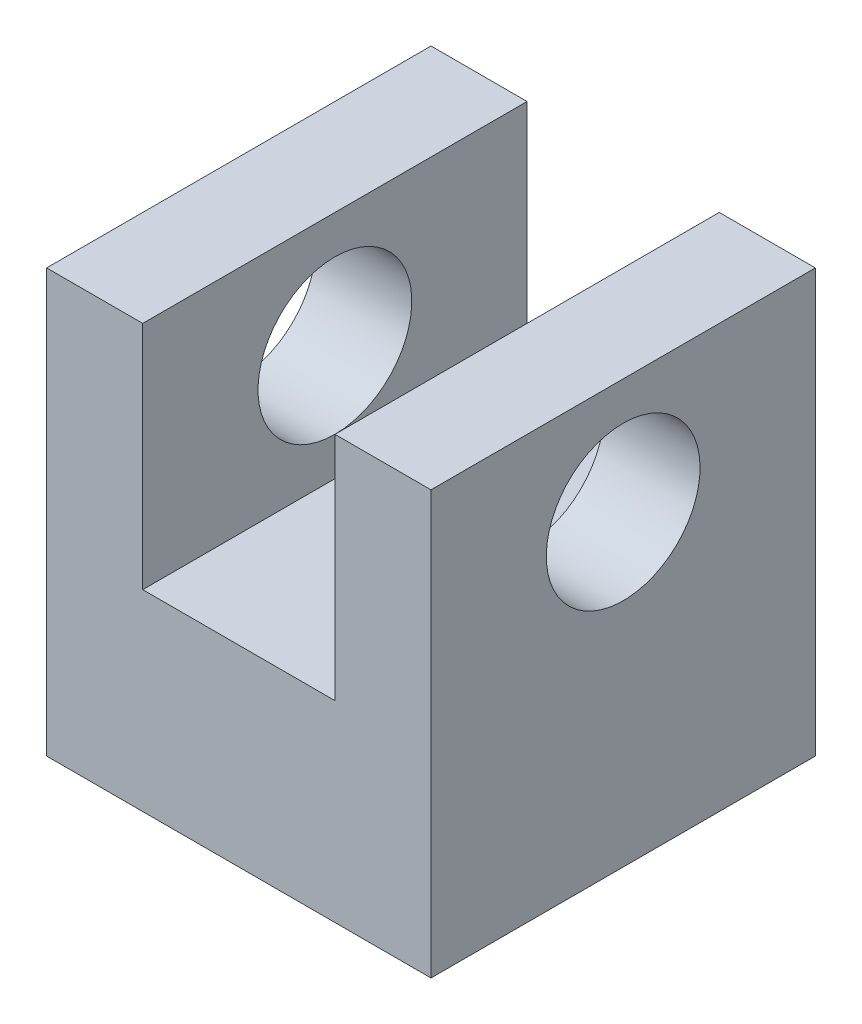
ISO-10303-21;
HEADER;
FILE_DESCRIPTION(('STEP AP214'),'2;1');
FILE_NAME('part.step','',(''),(''),'','','');
FILE_SCHEMA(('AUTOMOTIVE_DESIGN { 1 0 10303 214 1 1 1 1 }'));
ENDSEC;
DATA;
#1=APPLICATION_CONTEXT('core data for automotive mechanical design processes');
#2=APPLICATION_PROTOCOL_DEFINITION('international standard','automotive_design',2000,#1);
#3=PRODUCT_CONTEXT('',#1,'mechanical');
#4=PRODUCT('Part','Part','',(#3));
#5=PRODUCT_RELATED_PRODUCT_CATEGORY('part','',(#4));
#6=PRODUCT_DEFINITION_FORMATION('','',#4);
#7=PRODUCT_DEFINITION_CONTEXT('part definition',#1,'design');
#8=PRODUCT_DEFINITION('design','',#6,#7);
#9=PRODUCT_DEFINITION_SHAPE('','',#8);
#10=(LENGTH_UNIT() NAMED_UNIT(*) SI_UNIT(.MILLI.,.METRE.));
#11=(NAMED_UNIT(*) PLANE_ANGLE_UNIT() SI_UNIT($,.RADIAN.));
#12=(NAMED_UNIT(*) SI_UNIT($,.STERADIAN.) SOLID_ANGLE_UNIT());
#13=UNCERTAINTY_MEASURE_WITH_UNIT(LENGTH_MEASURE(1.E-05),#10,'distance_accuracy_value','');
#14=(GEOMETRIC_REPRESENTATION_CONTEXT(3) GLOBAL_UNCERTAINTY_ASSIGNED_CONTEXT((#13)) GLOBAL_UNIT_ASSIGNED_CONTEXT((#10,
#11,#12)) REPRESENTATION_CONTEXT('',''));
#15=CARTESIAN_POINT('',(0.,0.,0.));
#16=DIRECTION('',(0.,0.,1.));
#17=DIRECTION('',(1.,0.,0.));
#18=AXIS2_PLACEMENT_3D('',#15,#16,#17);
#19=CARTESIAN_POINT('',(10.,0.,20.));
#20=DIRECTION('',(-1.,0.,0.));
#21=DIRECTION('',(0.,0.,1.));
#22=AXIS2_PLACEMENT_3D('',#19,#20,#21);
#23=PLANE('',#22);
#24=CARTESIAN_POINT('',(10.,16.,10.));
#25=DIRECTION('',(1.,0.,0.));
#26=DIRECTION('',(0.,1.,0.));
#27=AXIS2_PLACEMENT_3D('',#24,#25,#26);
#28=CIRCLE('',#27,4.);
#29=CARTESIAN_POINT('',(10.,20.,10.));
#30=VERTEX_POINT('',#29);
#31=EDGE_CURVE('E218',#30,#30,#28,.T.);
#32=ORIENTED_EDGE('',*,*,#31,.F.);
#33=EDGE_LOOP('',(#32));
#34=FACE_BOUND('',#33,.T.);
#35=DIRECTION('',(0.,1.,0.));
#36=VECTOR('',#35,1.);
#37=CARTESIAN_POINT('',(10.,0.,0.));
#38=LINE('',#37,#36);
#39=CARTESIAN_POINT('',(10.,0.,0.));
#40=VERTEX_POINT('',#39);
#41=CARTESIAN_POINT('',(10.,22.,0.));
#42=VERTEX_POINT('',#41);
#43=EDGE_CURVE('E140',#40,#42,#38,.T.);
#44=ORIENTED_EDGE('',*,*,#43,.T.);
#45=DIRECTION('',(0.,0.,-1.));
#46=VECTOR('',#45,1.);
#47=CARTESIAN_POINT('',(10.,22.,20.));
#48=LINE('',#47,#46);
#49=CARTESIAN_POINT('',(10.,22.,20.));
#50=VERTEX_POINT('',#49);
#51=EDGE_CURVE('E11',#50,#42,#48,.T.);
#52=ORIENTED_EDGE('',*,*,#51,.F.);
#53=DIRECTION('',(0.,1.,0.));
#54=VECTOR('',#53,1.);
#55=CARTESIAN_POINT('',(10.,0.,20.));
#56=LINE('',#55,#54);
#57=CARTESIAN_POINT('',(10.,0.,20.));
#58=VERTEX_POINT('',#57);
#59=EDGE_CURVE('E163',#58,#50,#56,.T.);
#60=ORIENTED_EDGE('',*,*,#59,.F.);
#61=DIRECTION('',(0.,0.,-1.));
#62=VECTOR('',#61,1.);
#63=CARTESIAN_POINT('',(10.,0.,20.));
#64=LINE('',#63,#62);
#65=EDGE_CURVE('E136',#58,#40,#64,.T.);
#66=ORIENTED_EDGE('',*,*,#65,.T.);
#67=EDGE_LOOP('',(#44,#52,#60,#66));
#68=FACE_BOUND('',#67,.T.);
#69=ADVANCED_FACE('F39',(#34,#68),#23,.F.);
#70=CARTESIAN_POINT('',(10.,22.,20.));
#71=DIRECTION('',(0.,-1.,0.));
#72=DIRECTION('',(0.,0.,-1.));
#73=AXIS2_PLACEMENT_3D('',#70,#71,#72);
#74=PLANE('',#73);
#75=DIRECTION('',(-1.,0.,0.));
#76=VECTOR('',#75,1.);
#77=CARTESIAN_POINT('',(10.,22.,0.));
#78=LINE('',#77,#76);
#79=CARTESIAN_POINT('',(5.,22.,0.));
#80=VERTEX_POINT('',#79);
#81=EDGE_CURVE('E144',#42,#80,#78,.T.);
#82=ORIENTED_EDGE('',*,*,#81,.T.);
#83=DIRECTION('',(0.,0.,-1.));
#84=VECTOR('',#83,1.);
#85=CARTESIAN_POINT('',(5.,22.,20.));
#86=LINE('',#85,#84);
#87=CARTESIAN_POINT('',(5.,22.,20.));
#88=VERTEX_POINT('',#87);
#89=EDGE_CURVE('E48',#88,#80,#86,.T.);
#90=ORIENTED_EDGE('',*,*,#89,.F.);
#91=DIRECTION('',(-1.,0.,0.));
#92=VECTOR('',#91,1.);
#93=CARTESIAN_POINT('',(10.,22.,20.));
#94=LINE('',#93,#92);
#95=EDGE_CURVE('E99',#50,#88,#94,.T.);
#96=ORIENTED_EDGE('',*,*,#95,.F.);
#97=ORIENTED_EDGE('',*,*,#51,.T.);
#98=EDGE_LOOP('',(#82,#90,#96,#97));
#99=FACE_BOUND('',#98,.T.);
#100=ADVANCED_FACE('F228',(#99),#74,.F.);
#101=CARTESIAN_POINT('',(5.,22.,20.));
#102=DIRECTION('',(1.,0.,0.));
#103=DIRECTION('',(0.,1.,0.));
#104=AXIS2_PLACEMENT_3D('',#101,#102,#103);
#105=PLANE('',#104);
#106=CARTESIAN_POINT('',(5.,16.,10.));
#107=DIRECTION('',(1.,0.,0.));
#108=DIRECTION('',(0.,1.,0.));
#109=AXIS2_PLACEMENT_3D('',#106,#107,#108);
#110=CIRCLE('',#109,4.);
#111=CARTESIAN_POINT('',(5.,20.,10.));
#112=VERTEX_POINT('',#111);
#113=EDGE_CURVE('E145',#112,#112,#110,.T.);
#114=ORIENTED_EDGE('',*,*,#113,.T.);
#115=EDGE_LOOP('',(#114));
#116=FACE_BOUND('',#115,.T.);
#117=DIRECTION('',(0.,-1.,0.));
#118=VECTOR('',#117,1.);
#119=CARTESIAN_POINT('',(5.,22.,0.));
#120=LINE('',#119,#118);
#121=CARTESIAN_POINT('',(5.,10.,0.));
#122=VERTEX_POINT('',#121);
#123=EDGE_CURVE('E148',#80,#122,#120,.T.);
#124=ORIENTED_EDGE('',*,*,#123,.T.);
#125=DIRECTION('',(0.,0.,-1.));
#126=VECTOR('',#125,1.);
#127=CARTESIAN_POINT('',(5.,10.,20.));
#128=LINE('',#127,#126);
#129=CARTESIAN_POINT('',(5.,10.,20.));
#130=VERTEX_POINT('',#129);
#131=EDGE_CURVE('E174',#130,#122,#128,.T.);
#132=ORIENTED_EDGE('',*,*,#131,.F.);
#133=DIRECTION('',(0.,-1.,0.));
#134=VECTOR('',#133,1.);
#135=CARTESIAN_POINT('',(5.,22.,20.));
#136=LINE('',#135,#134);
#137=EDGE_CURVE('E184',#88,#130,#136,.T.);
#138=ORIENTED_EDGE('',*,*,#137,.F.);
#139=ORIENTED_EDGE('',*,*,#89,.T.);
#140=EDGE_LOOP('',(#124,#132,#138,#139));
#141=FACE_BOUND('',#140,.T.);
#142=ADVANCED_FACE('F182',(#116,#141),#105,.F.);
#143=CARTESIAN_POINT('',(5.,10.,20.));
#144=DIRECTION('',(0.,-1.,0.));
#145=DIRECTION('',(0.,0.,-1.));
#146=AXIS2_PLACEMENT_3D('',#143,#144,#145);
#147=PLANE('',#146);
#148=DIRECTION('',(-1.,0.,0.));
#149=VECTOR('',#148,1.);
#150=CARTESIAN_POINT('',(5.,10.,0.));
#151=LINE('',#150,#149);
#152=CARTESIAN_POINT('',(-5.,10.,0.));
#153=VERTEX_POINT('',#152);
#154=EDGE_CURVE('E151',#122,#153,#151,.T.);
#155=ORIENTED_EDGE('',*,*,#154,.T.);
#156=DIRECTION('',(0.,0.,-1.));
#157=VECTOR('',#156,1.);
#158=CARTESIAN_POINT('',(-5.,10.,20.));
#159=LINE('',#158,#157);
#160=CARTESIAN_POINT('',(-5.,10.,20.));
#161=VERTEX_POINT('',#160);
#162=EDGE_CURVE('E170',#161,#153,#159,.T.);
#163=ORIENTED_EDGE('',*,*,#162,.F.);
#164=DIRECTION('',(-1.,0.,0.));
#165=VECTOR('',#164,1.);
#166=CARTESIAN_POINT('',(5.,10.,20.));
#167=LINE('',#166,#165);
#168=EDGE_CURVE('E197',#130,#161,#167,.T.);
#169=ORIENTED_EDGE('',*,*,#168,.F.);
#170=ORIENTED_EDGE('',*,*,#131,.T.);
#171=EDGE_LOOP('',(#155,#163,#169,#170));
#172=FACE_BOUND('',#171,.T.);
#173=ADVANCED_FACE('F192',(#172),#147,.F.);
#174=CARTESIAN_POINT('',(-5.,22.,20.));
#175=DIRECTION('',(-1.,0.,0.));
#176=DIRECTION('',(0.,-1.,0.));
#177=AXIS2_PLACEMENT_3D('',#174,#175,#176);
#178=PLANE('',#177);
#179=CARTESIAN_POINT('',(-5.,16.,10.));
#180=DIRECTION('',(-1.,0.,0.));
#181=DIRECTION('',(0.,-1.,0.));
#182=AXIS2_PLACEMENT_3D('',#179,#180,#181);
#183=CIRCLE('',#182,4.);
#184=CARTESIAN_POINT('',(-5.,12.,10.));
#185=VERTEX_POINT('',#184);
#186=EDGE_CURVE('E210',#185,#185,#183,.T.);
#187=ORIENTED_EDGE('',*,*,#186,.T.);
#188=EDGE_LOOP('',(#187));
#189=FACE_BOUND('',#188,.T.);
#190=DIRECTION('',(0.,1.,0.));
#191=VECTOR('',#190,1.);
#192=CARTESIAN_POINT('',(-5.,22.,0.));
#193=LINE('',#192,#191);
#194=CARTESIAN_POINT('',(-5.,22.,0.));
#195=VERTEX_POINT('',#194);
#196=EDGE_CURVE('E154',#153,#195,#193,.T.);
#197=ORIENTED_EDGE('',*,*,#196,.T.);
#198=DIRECTION('',(0.,0.,-1.));
#199=VECTOR('',#198,1.);
#200=CARTESIAN_POINT('',(-5.,22.,20.));
#201=LINE('',#200,#199);
#202=CARTESIAN_POINT('',(-5.,22.,20.));
#203=VERTEX_POINT('',#202);
#204=EDGE_CURVE('E129',#203,#195,#201,.T.);
#205=ORIENTED_EDGE('',*,*,#204,.F.);
#206=DIRECTION('',(0.,1.,0.));
#207=VECTOR('',#206,1.);
#208=CARTESIAN_POINT('',(-5.,22.,20.));
#209=LINE('',#208,#207);
#210=EDGE_CURVE('E118',#161,#203,#209,.T.);
#211=ORIENTED_EDGE('',*,*,#210,.F.);
#212=ORIENTED_EDGE('',*,*,#162,.T.);
#213=EDGE_LOOP('',(#197,#205,#211,#212));
#214=FACE_BOUND('',#213,.T.);
#215=ADVANCED_FACE('F195',(#189,#214),#178,.F.);
#216=CARTESIAN_POINT('',(-10.,22.,20.));
#217=DIRECTION('',(0.,-1.,0.));
#218=DIRECTION('',(0.,0.,-1.));
#219=AXIS2_PLACEMENT_3D('',#216,#217,#218);
#220=PLANE('',#219);
#221=DIRECTION('',(-1.,0.,0.));
#222=VECTOR('',#221,1.);
#223=CARTESIAN_POINT('',(-10.,22.,0.));
#224=LINE('',#223,#222);
#225=CARTESIAN_POINT('',(-10.,22.,0.));
#226=VERTEX_POINT('',#225);
#227=EDGE_CURVE('E127',#195,#226,#224,.T.);
#228=ORIENTED_EDGE('',*,*,#227,.T.);
#229=DIRECTION('',(0.,0.,-1.));
#230=VECTOR('',#229,1.);
#231=CARTESIAN_POINT('',(-10.,22.,20.));
#232=LINE('',#231,#230);
#233=CARTESIAN_POINT('',(-10.,22.,20.));
#234=VERTEX_POINT('',#233);
#235=EDGE_CURVE('E124',#234,#226,#232,.T.);
#236=ORIENTED_EDGE('',*,*,#235,.F.);
#237=DIRECTION('',(-1.,0.,0.));
#238=VECTOR('',#237,1.);
#239=CARTESIAN_POINT('',(-10.,22.,20.));
#240=LINE('',#239,#238);
#241=EDGE_CURVE('E112',#203,#234,#240,.T.);
#242=ORIENTED_EDGE('',*,*,#241,.F.);
#243=ORIENTED_EDGE('',*,*,#204,.T.);
#244=EDGE_LOOP('',(#228,#236,#242,#243));
#245=FACE_BOUND('',#244,.T.);
#246=ADVANCED_FACE('F125',(#245),#220,.F.);
#247=CARTESIAN_POINT('',(-10.,0.,20.));
#248=DIRECTION('',(1.,0.,0.));
#249=DIRECTION('',(0.,0.,-1.));
#250=AXIS2_PLACEMENT_3D('',#247,#248,#249);
#251=PLANE('',#250);
#252=CARTESIAN_POINT('',(-10.,16.,10.));
#253=DIRECTION('',(1.,0.,0.));
#254=DIRECTION('',(0.,1.,0.));
#255=AXIS2_PLACEMENT_3D('',#252,#253,#254);
#256=CIRCLE('',#255,4.);
#257=CARTESIAN_POINT('',(-10.,20.,10.));
#258=VERTEX_POINT('',#257);
#259=EDGE_CURVE('E214',#258,#258,#256,.T.);
#260=ORIENTED_EDGE('',*,*,#259,.T.);
#261=EDGE_LOOP('',(#260));
#262=FACE_BOUND('',#261,.T.);
#263=DIRECTION('',(0.,-1.,0.));
#264=VECTOR('',#263,1.);
#265=CARTESIAN_POINT('',(-10.,0.,0.));
#266=LINE('',#265,#264);
#267=CARTESIAN_POINT('',(-10.,0.,0.));
#268=VERTEX_POINT('',#267);
#269=EDGE_CURVE('E85',#226,#268,#266,.T.);
#270=ORIENTED_EDGE('',*,*,#269,.T.);
#271=DIRECTION('',(0.,0.,-1.));
#272=VECTOR('',#271,1.);
#273=CARTESIAN_POINT('',(-10.,0.,20.));
#274=LINE('',#273,#272);
#275=CARTESIAN_POINT('',(-10.,0.,20.));
#276=VERTEX_POINT('',#275);
#277=EDGE_CURVE('E130',#276,#268,#274,.T.);
#278=ORIENTED_EDGE('',*,*,#277,.F.);
#279=DIRECTION('',(0.,-1.,0.));
#280=VECTOR('',#279,1.);
#281=CARTESIAN_POINT('',(-10.,0.,20.));
#282=LINE('',#281,#280);
#283=EDGE_CURVE('E116',#234,#276,#282,.T.);
#284=ORIENTED_EDGE('',*,*,#283,.F.);
#285=ORIENTED_EDGE('',*,*,#235,.T.);
#286=EDGE_LOOP('',(#270,#278,#284,#285));
#287=FACE_BOUND('',#286,.T.);
#288=ADVANCED_FACE('F132',(#262,#287),#251,.F.);
#289=CARTESIAN_POINT('',(-10.,0.,20.));
#290=DIRECTION('',(0.,1.,0.));
#291=DIRECTION('',(0.,0.,1.));
#292=AXIS2_PLACEMENT_3D('',#289,#290,#291);
#293=PLANE('',#292);
#294=DIRECTION('',(1.,0.,0.));
#295=VECTOR('',#294,1.);
#296=CARTESIAN_POINT('',(-10.,0.,0.));
#297=LINE('',#296,#295);
#298=EDGE_CURVE('E91',#268,#40,#297,.T.);
#299=ORIENTED_EDGE('',*,*,#298,.T.);
#300=ORIENTED_EDGE('',*,*,#65,.F.);
#301=DIRECTION('',(1.,0.,0.));
#302=VECTOR('',#301,1.);
#303=CARTESIAN_POINT('',(-10.,0.,20.));
#304=LINE('',#303,#302);
#305=EDGE_CURVE('E56',#276,#58,#304,.T.);
#306=ORIENTED_EDGE('',*,*,#305,.F.);
#307=ORIENTED_EDGE('',*,*,#277,.T.);
#308=EDGE_LOOP('',(#299,#300,#306,#307));
#309=FACE_BOUND('',#308,.T.);
#310=ADVANCED_FACE('F231',(#309),#293,.F.);
#311=CARTESIAN_POINT('',(0.,0.,20.));
#312=DIRECTION('',(0.,0.,1.));
#313=DIRECTION('',(1.,0.,0.));
#314=AXIS2_PLACEMENT_3D('',#311,#312,#313);
#315=PLANE('',#314);
#316=ORIENTED_EDGE('',*,*,#59,.T.);
#317=ORIENTED_EDGE('',*,*,#95,.T.);
#318=ORIENTED_EDGE('',*,*,#137,.T.);
#319=ORIENTED_EDGE('',*,*,#168,.T.);
#320=ORIENTED_EDGE('',*,*,#210,.T.);
#321=ORIENTED_EDGE('',*,*,#241,.T.);
#322=ORIENTED_EDGE('',*,*,#283,.T.);
#323=ORIENTED_EDGE('',*,*,#305,.T.);
#324=EDGE_LOOP('',(#316,#317,#318,#319,#320,#321,#322,#323));
#325=FACE_BOUND('',#324,.T.);
#326=ADVANCED_FACE('F114',(#325),#315,.T.);
#327=CARTESIAN_POINT('',(0.,0.,0.));
#328=DIRECTION('',(0.,0.,1.));
#329=DIRECTION('',(1.,0.,0.));
#330=AXIS2_PLACEMENT_3D('',#327,#328,#329);
#331=PLANE('',#330);
#332=ORIENTED_EDGE('',*,*,#43,.F.);
#333=ORIENTED_EDGE('',*,*,#298,.F.);
#334=ORIENTED_EDGE('',*,*,#269,.F.);
#335=ORIENTED_EDGE('',*,*,#227,.F.);
#336=ORIENTED_EDGE('',*,*,#196,.F.);
#337=ORIENTED_EDGE('',*,*,#154,.F.);
#338=ORIENTED_EDGE('',*,*,#123,.F.);
#339=ORIENTED_EDGE('',*,*,#81,.F.);
#340=EDGE_LOOP('',(#332,#333,#334,#335,#336,#337,#338,#339));
#341=FACE_BOUND('',#340,.T.);
#342=ADVANCED_FACE('F188',(#341),#331,.F.);
#343=CARTESIAN_POINT('',(-10.,16.,10.));
#344=DIRECTION('',(1.,0.,0.));
#345=DIRECTION('',(0.,1.,0.));
#346=AXIS2_PLACEMENT_3D('',#343,#344,#345);
#347=CYLINDRICAL_SURFACE('',#346,4.);
#348=ORIENTED_EDGE('',*,*,#259,.F.);
#349=EDGE_LOOP('',(#348));
#350=FACE_BOUND('',#349,.T.);
#351=ORIENTED_EDGE('',*,*,#186,.F.);
#352=EDGE_LOOP('',(#351));
#353=FACE_BOUND('',#352,.T.);
#354=ADVANCED_FACE('F283',(#350,#353),#347,.F.);
#355=ORIENTED_EDGE('',*,*,#31,.T.);
#356=EDGE_LOOP('',(#355));
#357=FACE_BOUND('',#356,.T.);
#358=ORIENTED_EDGE('',*,*,#113,.F.);
#359=EDGE_LOOP('',(#358));
#360=FACE_BOUND('',#359,.T.);
#361=ADVANCED_FACE('F223',(#357,#360),#347,.F.);
#362=CLOSED_SHELL('',(#69,#100,#142,#173,#215,#246,#288,#310,#326,#342,#354,#361));
#363=MANIFOLD_SOLID_BREP('B2',#362);
#364=ADVANCED_BREP_SHAPE_REPRESENTATION('',(#18,#363),#14);
#365=SHAPE_DEFINITION_REPRESENTATION(#9,#364);
ENDSEC;
END-ISO-10303-21;
